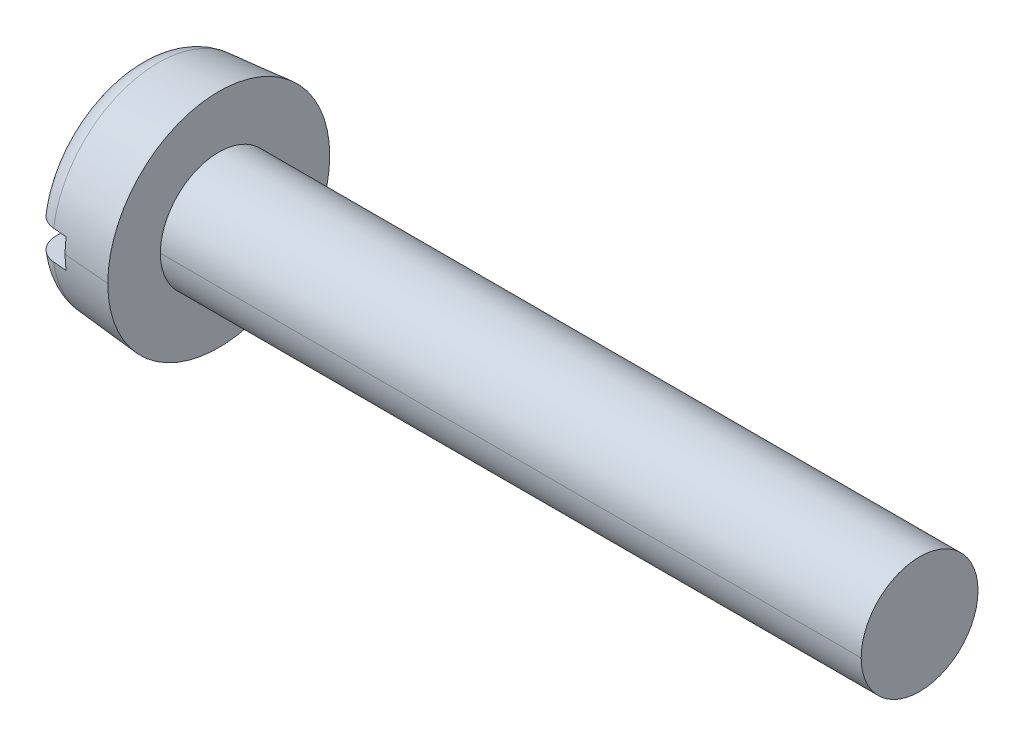
ISO-10303-21;
HEADER;
FILE_DESCRIPTION(('STEP AP214'),'2;1');
FILE_NAME('part.step','',(''),(''),'','','');
FILE_SCHEMA(('AUTOMOTIVE_DESIGN { 1 0 10303 214 1 1 1 1 }'));
ENDSEC;
DATA;
#1=APPLICATION_CONTEXT('core data for automotive mechanical design processes');
#2=APPLICATION_PROTOCOL_DEFINITION('international standard','automotive_design',2000,#1);
#3=PRODUCT_CONTEXT('',#1,'mechanical');
#4=PRODUCT('Part','Part','',(#3));
#5=PRODUCT_RELATED_PRODUCT_CATEGORY('part','',(#4));
#6=PRODUCT_DEFINITION_FORMATION('','',#4);
#7=PRODUCT_DEFINITION_CONTEXT('part definition',#1,'design');
#8=PRODUCT_DEFINITION('design','',#6,#7);
#9=PRODUCT_DEFINITION_SHAPE('','',#8);
#10=(LENGTH_UNIT() NAMED_UNIT(*) SI_UNIT(.MILLI.,.METRE.));
#11=(NAMED_UNIT(*) PLANE_ANGLE_UNIT() SI_UNIT($,.RADIAN.));
#12=(NAMED_UNIT(*) SI_UNIT($,.STERADIAN.) SOLID_ANGLE_UNIT());
#13=UNCERTAINTY_MEASURE_WITH_UNIT(LENGTH_MEASURE(1.E-05),#10,'distance_accuracy_value','');
#14=(GEOMETRIC_REPRESENTATION_CONTEXT(3) GLOBAL_UNCERTAINTY_ASSIGNED_CONTEXT((#13)) GLOBAL_UNIT_ASSIGNED_CONTEXT((#10,
#11,#12)) REPRESENTATION_CONTEXT('',''));
#15=CARTESIAN_POINT('',(0.,0.,0.));
#16=DIRECTION('',(0.,0.,1.));
#17=DIRECTION('',(1.,0.,0.));
#18=AXIS2_PLACEMENT_3D('',#15,#16,#17);
#19=CARTESIAN_POINT('',(0.,0.,0.));
#20=DIRECTION('',(-1.,0.,0.));
#21=DIRECTION('',(0.,0.,1.));
#22=AXIS2_PLACEMENT_3D('',#19,#20,#21);
#23=CYLINDRICAL_SURFACE('',#22,1.);
#24=CARTESIAN_POINT('',(13.4,0.,0.));
#25=DIRECTION('',(-1.,0.,0.));
#26=DIRECTION('',(0.,0.,1.));
#27=AXIS2_PLACEMENT_3D('',#24,#25,#26);
#28=CIRCLE('',#27,1.);
#29=CARTESIAN_POINT('',(13.4,0.,1.));
#30=VERTEX_POINT('',#29);
#31=CARTESIAN_POINT('',(13.4,0.,-1.));
#32=VERTEX_POINT('',#31);
#33=EDGE_CURVE('E11',#30,#32,#28,.T.);
#34=ORIENTED_EDGE('',*,*,#33,.T.);
#35=DIRECTION('',(-1.,0.,0.));
#36=VECTOR('',#35,1.);
#37=CARTESIAN_POINT('',(0.,0.,-1.));
#38=LINE('',#37,#36);
#39=CARTESIAN_POINT('',(1.4,0.,-1.));
#40=VERTEX_POINT('',#39);
#41=EDGE_CURVE('E30',#32,#40,#38,.T.);
#42=ORIENTED_EDGE('',*,*,#41,.T.);
#43=CARTESIAN_POINT('',(1.4,0.,0.));
#44=DIRECTION('',(-1.,0.,0.));
#45=DIRECTION('',(0.,0.,1.));
#46=AXIS2_PLACEMENT_3D('',#43,#44,#45);
#47=CIRCLE('',#46,1.);
#48=CARTESIAN_POINT('',(1.4,0.,1.));
#49=VERTEX_POINT('',#48);
#50=EDGE_CURVE('E326',#49,#40,#47,.T.);
#51=ORIENTED_EDGE('',*,*,#50,.F.);
#52=DIRECTION('',(-1.,0.,0.));
#53=VECTOR('',#52,1.);
#54=CARTESIAN_POINT('',(0.,0.,1.));
#55=LINE('',#54,#53);
#56=EDGE_CURVE('E589',#30,#49,#55,.T.);
#57=ORIENTED_EDGE('',*,*,#56,.F.);
#58=EDGE_LOOP('',(#34,#42,#51,#57));
#59=FACE_BOUND('',#58,.T.);
#60=ADVANCED_FACE('F17',(#59),#23,.T.);
#61=CARTESIAN_POINT('',(1.4,0.,0.));
#62=DIRECTION('',(1.,0.,0.));
#63=DIRECTION('',(0.,0.,-1.));
#64=AXIS2_PLACEMENT_3D('',#61,#62,#63);
#65=CONICAL_SURFACE('',#64,1.9,0.0872664625997163);
#66=CARTESIAN_POINT('',(0.6,0.,0.));
#67=DIRECTION('',(-1.,0.,0.));
#68=DIRECTION('',(0.,0.,1.));
#69=AXIS2_PLACEMENT_3D('',#66,#67,#68);
#70=CIRCLE('',#69,1.83000906917926);
#71=CARTESIAN_POINT('',(0.6,0.,1.83000906917926));
#72=VERTEX_POINT('',#71);
#73=CARTESIAN_POINT('',(0.6,0.25,1.8128522259904));
#74=VERTEX_POINT('',#73);
#75=EDGE_CURVE('E314',#72,#74,#70,.T.);
#76=ORIENTED_EDGE('',*,*,#75,.F.);
#77=DIRECTION('',(0.996194698091746,0.,0.0871557427476584));
#78=VECTOR('',#77,1.);
#79=CARTESIAN_POINT('',(1.4,0.,1.9));
#80=LINE('',#79,#78);
#81=CARTESIAN_POINT('',(1.4,0.,1.9));
#82=VERTEX_POINT('',#81);
#83=EDGE_CURVE('E575',#72,#82,#80,.T.);
#84=ORIENTED_EDGE('',*,*,#83,.T.);
#85=CARTESIAN_POINT('',(1.4,0.,0.));
#86=DIRECTION('',(-1.,0.,0.));
#87=DIRECTION('',(0.,0.,1.));
#88=AXIS2_PLACEMENT_3D('',#85,#86,#87);
#89=CIRCLE('',#88,1.9);
#90=CARTESIAN_POINT('',(1.4,0.,-1.9));
#91=VERTEX_POINT('',#90);
#92=EDGE_CURVE('E187',#82,#91,#89,.T.);
#93=ORIENTED_EDGE('',*,*,#92,.T.);
#94=DIRECTION('',(0.996194698091746,0.,-0.0871557427476584));
#95=VECTOR('',#94,1.);
#96=CARTESIAN_POINT('',(1.4,0.,-1.9));
#97=LINE('',#96,#95);
#98=CARTESIAN_POINT('',(0.6,0.,-1.83000906917926));
#99=VERTEX_POINT('',#98);
#100=EDGE_CURVE('E265',#99,#91,#97,.T.);
#101=ORIENTED_EDGE('',*,*,#100,.F.);
#102=CARTESIAN_POINT('',(0.6,0.,0.));
#103=DIRECTION('',(-1.,0.,0.));
#104=DIRECTION('',(0.,0.,1.));
#105=AXIS2_PLACEMENT_3D('',#102,#103,#104);
#106=CIRCLE('',#105,1.83000906917926);
#107=CARTESIAN_POINT('',(0.6,0.25,-1.8128522259904));
#108=VERTEX_POINT('',#107);
#109=EDGE_CURVE('E583',#108,#99,#106,.T.);
#110=ORIENTED_EDGE('',*,*,#109,.F.);
#111=CARTESIAN_POINT('',(0.6,0.25,-1.8128522259904));
#112=CARTESIAN_POINT('',(0.549769017917673,0.25,-1.80841599358979));
#113=CARTESIAN_POINT('',(0.499538062464663,0.25,-1.8039794596575));
#114=CARTESIAN_POINT('',(0.449307134241759,0.25,-1.7995426174547));
#115=CARTESIAN_POINT('',(0.421250648597372,0.25,-1.79706441918177));
#116=CARTESIAN_POINT('',(0.393194171448044,0.25,-1.7945861247316));
#117=CARTESIAN_POINT('',(0.365137702900937,0.25,-1.79210773290244));
#118=(BOUNDED_CURVE() B_SPLINE_CURVE(3,(#111,#112,#113,#114,#115,#116,#117),.UNSPECIFIED.,.F.,
.F.) B_SPLINE_CURVE_WITH_KNOTS((4,3,4),(0.00319106621206755,0.00334234570568948,
0.00342684286890468),
.UNSPECIFIED.) CURVE() GEOMETRIC_REPRESENTATION_ITEM() RATIONAL_B_SPLINE_CURVE((1.,1.,1.,1.,1.,
1.,1.)) REPRESENTATION_ITEM(''));
#119=CARTESIAN_POINT('',(0.365137702900937,0.25,-1.79210773290244));
#120=VERTEX_POINT('',#119);
#121=EDGE_CURVE('E137',#108,#120,#118,.T.);
#122=ORIENTED_EDGE('',*,*,#121,.T.);
#123=CARTESIAN_POINT('',(0.365137702900937,0.,0.));
#124=DIRECTION('',(1.,0.,0.));
#125=DIRECTION('',(0.,0.,1.));
#126=AXIS2_PLACEMENT_3D('',#123,#124,#125);
#127=CIRCLE('',#126,1.80946128069343);
#128=CARTESIAN_POINT('',(0.365137702900959,0.25,1.79210773290293));
#129=VERTEX_POINT('',#128);
#130=EDGE_CURVE('E132',#120,#129,#127,.T.);
#131=ORIENTED_EDGE('',*,*,#130,.T.);
#132=CARTESIAN_POINT('',(0.365137702900959,0.25,1.79210773290293));
#133=CARTESIAN_POINT('',(0.393194171448087,0.25,1.79458612473161));
#134=CARTESIAN_POINT('',(0.421250648597394,0.25,1.79706441918177));
#135=CARTESIAN_POINT('',(0.449307134241759,0.25,1.7995426174547));
#136=CARTESIAN_POINT('',(0.499538062464663,0.25,1.8039794596575));
#137=CARTESIAN_POINT('',(0.549769017917673,0.25,1.80841599358979));
#138=CARTESIAN_POINT('',(0.6,0.25,1.8128522259904));
#139=(BOUNDED_CURVE() B_SPLINE_CURVE(3,(#132,#133,#134,#135,#136,#137,#138),.UNSPECIFIED.,.F.,
.F.) B_SPLINE_CURVE_WITH_KNOTS((4,3,4),(0.00325784856487663,0.00334234572775568,
0.00349362522084869),
.UNSPECIFIED.) CURVE() GEOMETRIC_REPRESENTATION_ITEM() RATIONAL_B_SPLINE_CURVE((1.,1.,1.,1.,1.,
1.,1.)) REPRESENTATION_ITEM(''));
#140=EDGE_CURVE('E121',#129,#74,#139,.T.);
#141=ORIENTED_EDGE('',*,*,#140,.T.);
#142=EDGE_LOOP('',(#76,#84,#93,#101,#110,#122,#131,#141));
#143=FACE_BOUND('',#142,.T.);
#144=ADVANCED_FACE('F136',(#143),#65,.T.);
#145=CARTESIAN_POINT('',(0.,0.,0.));
#146=DIRECTION('',(1.,0.,0.));
#147=DIRECTION('',(0.,1.,0.));
#148=AXIS2_PLACEMENT_3D('',#145,#146,#147);
#149=PLANE('',#148);
#150=CARTESIAN_POINT('',(0.,0.,0.));
#151=DIRECTION('',(-1.,0.,0.));
#152=DIRECTION('',(0.,0.,-1.));
#153=AXIS2_PLACEMENT_3D('',#150,#151,#152);
#154=CIRCLE('',#153,1.41098340145674);
#155=CARTESIAN_POINT('',(0.,0.25,1.38865912274626));
#156=VERTEX_POINT('',#155);
#157=CARTESIAN_POINT('',(0.,0.25,-1.38865912274626));
#158=VERTEX_POINT('',#157);
#159=EDGE_CURVE('E133',#156,#158,#154,.T.);
#160=ORIENTED_EDGE('',*,*,#159,.T.);
#161=DIRECTION('',(0.,0.,-1.));
#162=VECTOR('',#161,1.);
#163=CARTESIAN_POINT('',(0.,0.25,-1.9));
#164=LINE('',#163,#162);
#165=EDGE_CURVE('E148',#156,#158,#164,.T.);
#166=ORIENTED_EDGE('',*,*,#165,.F.);
#167=EDGE_LOOP('',(#160,#166));
#168=FACE_BOUND('',#167,.T.);
#169=ADVANCED_FACE('F168',(#168),#149,.F.);
#170=CARTESIAN_POINT('',(0.4,0.,0.));
#171=DIRECTION('',(1.,0.,0.));
#172=DIRECTION('',(0.,0.,-1.));
#173=AXIS2_PLACEMENT_3D('',#170,#171,#172);
#174=TOROIDAL_SURFACE('',#173,1.41098340145674,0.4);
#175=CARTESIAN_POINT('',(0.,0.25,-1.38865912274626));
#176=CARTESIAN_POINT('',(0.,0.25,-1.46251622227619));
#177=CARTESIAN_POINT('',(0.026960417168731,0.25,-1.5343648727742));
#178=CARTESIAN_POINT('',(0.053195686998227,0.25,-1.60428102877814));
#179=CARTESIAN_POINT('',(0.103966295066659,0.25,-1.66128361495215));
#180=CARTESIAN_POINT('',(0.152590985685726,0.25,-1.71587687712979));
#181=CARTESIAN_POINT('',(0.222580261018464,0.25,-1.75127465267984));
#182=CARTESIAN_POINT('',(0.290233625586207,0.25,-1.78549101801282));
#183=CARTESIAN_POINT('',(0.365137702900937,0.25,-1.79210773290244));
#184=B_SPLINE_CURVE_WITH_KNOTS('',2,(#175,#176,#177,#178,#179,#180,#181,#182,#183),
.UNSPECIFIED.,.F.,.F.,(3,2,2,2,3),(0.,0.25,0.5,0.75,1.),.UNSPECIFIED.);
#185=EDGE_CURVE('E626',#158,#120,#184,.T.);
#186=ORIENTED_EDGE('',*,*,#185,.F.);
#187=ORIENTED_EDGE('',*,*,#159,.F.);
#188=CARTESIAN_POINT('',(0.365137702900959,0.25,1.79210773290293));
#189=CARTESIAN_POINT('',(0.29185798650255,0.25,1.78563450730545));
#190=CARTESIAN_POINT('',(0.222397826019831,0.25,1.75117859067216));
#191=CARTESIAN_POINT('',(0.155444181685095,0.25,1.71796603873648));
#192=CARTESIAN_POINT('',(0.104194373722597,0.25,1.66153721924653));
#193=CARTESIAN_POINT('',(0.0554327580786059,0.25,1.60784803451385));
#194=CARTESIAN_POINT('',(0.0272203643972849,0.25,1.53472414118304));
#195=CARTESIAN_POINT('',(0.,0.25,1.46417149523968));
#196=CARTESIAN_POINT('',(0.,0.25,1.38865912274627));
#197=B_SPLINE_CURVE_WITH_KNOTS('',2,(#188,#189,#190,#191,#192,#193,#194,#195,#196),
.UNSPECIFIED.,.F.,.F.,(3,2,2,2,3),(0.,0.25,0.5,0.75,1.),.UNSPECIFIED.);
#198=EDGE_CURVE('E125',#129,#156,#197,.T.);
#199=ORIENTED_EDGE('',*,*,#198,.F.);
#200=ORIENTED_EDGE('',*,*,#130,.F.);
#201=EDGE_LOOP('',(#186,#187,#199,#200));
#202=FACE_BOUND('',#201,.T.);
#203=ADVANCED_FACE('F145',(#202),#174,.T.);
#204=CARTESIAN_POINT('',(0.,0.,0.));
#205=DIRECTION('',(1.,0.,0.));
#206=DIRECTION('',(0.,1.,0.));
#207=AXIS2_PLACEMENT_3D('',#204,#205,#206);
#208=PLANE('',#207);
#209=CARTESIAN_POINT('',(0.,0.,0.));
#210=DIRECTION('',(-1.,0.,0.));
#211=DIRECTION('',(0.,0.,-1.));
#212=AXIS2_PLACEMENT_3D('',#209,#210,#211);
#213=CIRCLE('',#212,1.41098340145674);
#214=CARTESIAN_POINT('',(0.,-0.25,-1.38865912274626));
#215=VERTEX_POINT('',#214);
#216=CARTESIAN_POINT('',(0.,-0.25,1.38865912274626));
#217=VERTEX_POINT('',#216);
#218=EDGE_CURVE('E245',#215,#217,#213,.T.);
#219=ORIENTED_EDGE('',*,*,#218,.T.);
#220=DIRECTION('',(0.,0.,1.));
#221=VECTOR('',#220,1.);
#222=CARTESIAN_POINT('',(0.,-0.25,-1.9));
#223=LINE('',#222,#221);
#224=EDGE_CURVE('E272',#215,#217,#223,.T.);
#225=ORIENTED_EDGE('',*,*,#224,.F.);
#226=EDGE_LOOP('',(#219,#225));
#227=FACE_BOUND('',#226,.T.);
#228=ADVANCED_FACE('F167',(#227),#208,.F.);
#229=CARTESIAN_POINT('',(1.4,0.,0.));
#230=DIRECTION('',(1.,0.,0.));
#231=DIRECTION('',(0.,0.,-1.));
#232=AXIS2_PLACEMENT_3D('',#229,#230,#231);
#233=CONICAL_SURFACE('',#232,1.9,0.0872664625997163);
#234=ORIENTED_EDGE('',*,*,#83,.F.);
#235=CARTESIAN_POINT('',(0.6,0.,0.));
#236=DIRECTION('',(-1.,0.,0.));
#237=DIRECTION('',(0.,0.,1.));
#238=AXIS2_PLACEMENT_3D('',#235,#236,#237);
#239=CIRCLE('',#238,1.83000906917926);
#240=CARTESIAN_POINT('',(0.6,-0.25,1.8128522259904));
#241=VERTEX_POINT('',#240);
#242=EDGE_CURVE('E304',#241,#72,#239,.T.);
#243=ORIENTED_EDGE('',*,*,#242,.F.);
#244=CARTESIAN_POINT('',(0.6,-0.25,1.8128522259904));
#245=CARTESIAN_POINT('',(0.549769017917673,-0.25,1.80841599358979));
#246=CARTESIAN_POINT('',(0.499538062464663,-0.25,1.8039794596575));
#247=CARTESIAN_POINT('',(0.449307134241759,-0.25,1.7995426174547));
#248=CARTESIAN_POINT('',(0.421250648596907,-0.25,1.79706441918173));
#249=CARTESIAN_POINT('',(0.393194171447115,-0.25,1.79458612473151));
#250=CARTESIAN_POINT('',(0.365137702898778,-0.25,1.79210773291097));
#251=(BOUNDED_CURVE() B_SPLINE_CURVE(3,(#244,#245,#246,#247,#248,#249,#250),.UNSPECIFIED.,.F.,
.F.) B_SPLINE_CURVE_WITH_KNOTS((4,3,4),(0.00319106621206755,0.00334234570568948,
0.00342684286890607),
.UNSPECIFIED.) CURVE() GEOMETRIC_REPRESENTATION_ITEM() RATIONAL_B_SPLINE_CURVE((1.,1.,1.,1.,1.,
1.,1.)) REPRESENTATION_ITEM(''));
#252=CARTESIAN_POINT('',(0.365137702898778,-0.25,1.79210773291097));
#253=VERTEX_POINT('',#252);
#254=EDGE_CURVE('E237',#241,#253,#251,.T.);
#255=ORIENTED_EDGE('',*,*,#254,.T.);
#256=CARTESIAN_POINT('',(0.365137702900937,0.,0.));
#257=DIRECTION('',(1.,0.,0.));
#258=DIRECTION('',(0.,0.,1.));
#259=AXIS2_PLACEMENT_3D('',#256,#257,#258);
#260=CIRCLE('',#259,1.80946128069343);
#261=CARTESIAN_POINT('',(0.365137702900937,-0.25,-1.79210773290244));
#262=VERTEX_POINT('',#261);
#263=EDGE_CURVE('E246',#253,#262,#260,.T.);
#264=ORIENTED_EDGE('',*,*,#263,.T.);
#265=CARTESIAN_POINT('',(0.365137702900937,-0.25,-1.79210773290244));
#266=CARTESIAN_POINT('',(0.393194171448044,-0.25,-1.7945861247316));
#267=CARTESIAN_POINT('',(0.421250648597372,-0.25,-1.79706441918177));
#268=CARTESIAN_POINT('',(0.449307134241759,-0.25,-1.7995426174547));
#269=CARTESIAN_POINT('',(0.499538062464663,-0.25,-1.8039794596575));
#270=CARTESIAN_POINT('',(0.549769017917673,-0.25,-1.80841599358979));
#271=CARTESIAN_POINT('',(0.6,-0.25,-1.8128522259904));
#272=(BOUNDED_CURVE() B_SPLINE_CURVE(3,(#265,#266,#267,#268,#269,#270,#271),.UNSPECIFIED.,.F.,
.F.) B_SPLINE_CURVE_WITH_KNOTS((4,3,4),(0.00325784856487656,0.00334234572775568,
0.00349362522084869),
.UNSPECIFIED.) CURVE() GEOMETRIC_REPRESENTATION_ITEM() RATIONAL_B_SPLINE_CURVE((1.,1.,1.,1.,1.,
1.,1.)) REPRESENTATION_ITEM(''));
#273=CARTESIAN_POINT('',(0.6,-0.25,-1.8128522259904));
#274=VERTEX_POINT('',#273);
#275=EDGE_CURVE('E215',#262,#274,#272,.T.);
#276=ORIENTED_EDGE('',*,*,#275,.T.);
#277=CARTESIAN_POINT('',(0.6,0.,0.));
#278=DIRECTION('',(-1.,0.,0.));
#279=DIRECTION('',(0.,0.,1.));
#280=AXIS2_PLACEMENT_3D('',#277,#278,#279);
#281=CIRCLE('',#280,1.83000906917926);
#282=EDGE_CURVE('E303',#99,#274,#281,.T.);
#283=ORIENTED_EDGE('',*,*,#282,.F.);
#284=ORIENTED_EDGE('',*,*,#100,.T.);
#285=CARTESIAN_POINT('',(1.4,0.,0.));
#286=DIRECTION('',(-1.,0.,0.));
#287=DIRECTION('',(0.,0.,1.));
#288=AXIS2_PLACEMENT_3D('',#285,#286,#287);
#289=CIRCLE('',#288,1.9);
#290=EDGE_CURVE('E322',#91,#82,#289,.T.);
#291=ORIENTED_EDGE('',*,*,#290,.T.);
#292=EDGE_LOOP('',(#234,#243,#255,#264,#276,#283,#284,#291));
#293=FACE_BOUND('',#292,.T.);
#294=ADVANCED_FACE('F19',(#293),#233,.T.);
#295=CARTESIAN_POINT('',(1.4,1.9,0.));
#296=DIRECTION('',(-1.,0.,0.));
#297=DIRECTION('',(0.,0.,1.));
#298=AXIS2_PLACEMENT_3D('',#295,#296,#297);
#299=PLANE('',#298);
#300=ORIENTED_EDGE('',*,*,#290,.F.);
#301=ORIENTED_EDGE('',*,*,#92,.F.);
#302=EDGE_LOOP('',(#300,#301));
#303=FACE_BOUND('',#302,.T.);
#304=ORIENTED_EDGE('',*,*,#50,.T.);
#305=CARTESIAN_POINT('',(1.4,0.,0.));
#306=DIRECTION('',(-1.,0.,0.));
#307=DIRECTION('',(0.,0.,1.));
#308=AXIS2_PLACEMENT_3D('',#305,#306,#307);
#309=CIRCLE('',#308,1.);
#310=EDGE_CURVE('E667',#40,#49,#309,.T.);
#311=ORIENTED_EDGE('',*,*,#310,.T.);
#312=EDGE_LOOP('',(#304,#311));
#313=FACE_BOUND('',#312,.T.);
#314=ADVANCED_FACE('F228',(#303,#313),#299,.F.);
#315=CARTESIAN_POINT('',(0.,0.,0.));
#316=DIRECTION('',(-1.,0.,0.));
#317=DIRECTION('',(0.,0.,1.));
#318=AXIS2_PLACEMENT_3D('',#315,#316,#317);
#319=CYLINDRICAL_SURFACE('',#318,1.);
#320=ORIENTED_EDGE('',*,*,#41,.F.);
#321=CARTESIAN_POINT('',(13.4,0.,0.));
#322=DIRECTION('',(-1.,0.,0.));
#323=DIRECTION('',(0.,0.,1.));
#324=AXIS2_PLACEMENT_3D('',#321,#322,#323);
#325=CIRCLE('',#324,1.);
#326=EDGE_CURVE('E673',#32,#30,#325,.T.);
#327=ORIENTED_EDGE('',*,*,#326,.T.);
#328=ORIENTED_EDGE('',*,*,#56,.T.);
#329=ORIENTED_EDGE('',*,*,#310,.F.);
#330=EDGE_LOOP('',(#320,#327,#328,#329));
#331=FACE_BOUND('',#330,.T.);
#332=ADVANCED_FACE('F171',(#331),#319,.T.);
#333=CARTESIAN_POINT('',(13.4,1.,0.));
#334=DIRECTION('',(-1.,0.,0.));
#335=DIRECTION('',(0.,0.,1.));
#336=AXIS2_PLACEMENT_3D('',#333,#334,#335);
#337=PLANE('',#336);
#338=ORIENTED_EDGE('',*,*,#33,.F.);
#339=ORIENTED_EDGE('',*,*,#326,.F.);
#340=EDGE_LOOP('',(#338,#339));
#341=FACE_BOUND('',#340,.T.);
#342=ADVANCED_FACE('F227',(#341),#337,.F.);
#343=CARTESIAN_POINT('',(0.4,0.,0.));
#344=DIRECTION('',(1.,0.,0.));
#345=DIRECTION('',(0.,0.,-1.));
#346=AXIS2_PLACEMENT_3D('',#343,#344,#345);
#347=TOROIDAL_SURFACE('',#346,1.41098340145674,0.4);
#348=CARTESIAN_POINT('',(0.365137702900937,-0.25,-1.79210773290244));
#349=CARTESIAN_POINT('',(0.291437131902306,-0.25,-1.78559733075897));
#350=CARTESIAN_POINT('',(0.22219649316851,-0.25,-1.7512156416243));
#351=CARTESIAN_POINT('',(0.155571204508869,-0.25,-1.71813261401084));
#352=CARTESIAN_POINT('',(0.104145980214715,-0.25,-1.66148344588308));
#353=CARTESIAN_POINT('',(0.0551789764167699,-0.25,-1.60754221239432));
#354=CARTESIAN_POINT('',(0.0271281505162559,-0.25,-1.53493574681391));
#355=CARTESIAN_POINT('',(0.,-0.25,-1.46471752458742));
#356=CARTESIAN_POINT('',(0.,-0.25,-1.38865912274626));
#357=B_SPLINE_CURVE_WITH_KNOTS('',2,(#348,#349,#350,#351,#352,#353,#354,#355,#356),
.UNSPECIFIED.,.F.,.F.,(3,2,2,2,3),(0.,0.25,0.5,0.75,1.),.UNSPECIFIED.);
#358=EDGE_CURVE('E199',#262,#215,#357,.T.);
#359=ORIENTED_EDGE('',*,*,#358,.F.);
#360=ORIENTED_EDGE('',*,*,#263,.F.);
#361=CARTESIAN_POINT('',(0.,-0.25,1.38865912274627));
#362=CARTESIAN_POINT('',(0.,-0.25,1.46315447616691));
#363=CARTESIAN_POINT('',(0.0270786285490139,-0.25,1.53498265899196));
#364=CARTESIAN_POINT('',(0.053283148473742,-0.25,1.60449220023733));
#365=CARTESIAN_POINT('',(0.104220023837533,-0.25,1.66156571297043));
#366=CARTESIAN_POINT('',(0.152903956736866,-0.25,1.71611485923006));
#367=CARTESIAN_POINT('',(0.222641905352023,-0.25,1.75136599302031));
#368=CARTESIAN_POINT('',(0.290134778658801,-0.25,1.78548228628779));
#369=CARTESIAN_POINT('',(0.365137702898777,-0.25,1.79210773291097));
#370=B_SPLINE_CURVE_WITH_KNOTS('',2,(#361,#362,#363,#364,#365,#366,#367,#368,#369),
.UNSPECIFIED.,.F.,.F.,(3,2,2,2,3),(0.,0.25,0.5,0.75,1.),.UNSPECIFIED.);
#371=EDGE_CURVE('E275',#217,#253,#370,.T.);
#372=ORIENTED_EDGE('',*,*,#371,.F.);
#373=ORIENTED_EDGE('',*,*,#218,.F.);
#374=EDGE_LOOP('',(#359,#360,#372,#373));
#375=FACE_BOUND('',#374,.T.);
#376=ADVANCED_FACE('F217',(#375),#347,.T.);
#377=CARTESIAN_POINT('',(0.6,-0.25,-1.9));
#378=DIRECTION('',(-1.,0.,0.));
#379=DIRECTION('',(0.,0.,1.));
#380=AXIS2_PLACEMENT_3D('',#377,#378,#379);
#381=PLANE('',#380);
#382=ORIENTED_EDGE('',*,*,#109,.T.);
#383=ORIENTED_EDGE('',*,*,#282,.T.);
#384=DIRECTION('',(0.,0.,1.));
#385=VECTOR('',#384,1.);
#386=CARTESIAN_POINT('',(0.6,-0.25,-1.9));
#387=LINE('',#386,#385);
#388=EDGE_CURVE('E301',#274,#241,#387,.T.);
#389=ORIENTED_EDGE('',*,*,#388,.T.);
#390=ORIENTED_EDGE('',*,*,#242,.T.);
#391=ORIENTED_EDGE('',*,*,#75,.T.);
#392=DIRECTION('',(0.,0.,-1.));
#393=VECTOR('',#392,1.);
#394=CARTESIAN_POINT('',(0.6,0.25,-1.9));
#395=LINE('',#394,#393);
#396=EDGE_CURVE('E129',#74,#108,#395,.T.);
#397=ORIENTED_EDGE('',*,*,#396,.T.);
#398=EDGE_LOOP('',(#382,#383,#389,#390,#391,#397));
#399=FACE_BOUND('',#398,.T.);
#400=ADVANCED_FACE('F226',(#399),#381,.T.);
#401=CARTESIAN_POINT('',(0.6,0.25,-1.9));
#402=DIRECTION('',(0.,1.,0.));
#403=DIRECTION('',(1.,0.,0.));
#404=AXIS2_PLACEMENT_3D('',#401,#402,#403);
#405=PLANE('',#404);
#406=ORIENTED_EDGE('',*,*,#396,.F.);
#407=ORIENTED_EDGE('',*,*,#140,.F.);
#408=ORIENTED_EDGE('',*,*,#198,.T.);
#409=ORIENTED_EDGE('',*,*,#165,.T.);
#410=ORIENTED_EDGE('',*,*,#185,.T.);
#411=ORIENTED_EDGE('',*,*,#121,.F.);
#412=EDGE_LOOP('',(#406,#407,#408,#409,#410,#411));
#413=FACE_BOUND('',#412,.T.);
#414=ADVANCED_FACE('F123',(#413),#405,.F.);
#415=CARTESIAN_POINT('',(0.6,-0.25,-1.9));
#416=DIRECTION('',(0.,-1.,0.));
#417=DIRECTION('',(0.,0.,-1.));
#418=AXIS2_PLACEMENT_3D('',#415,#416,#417);
#419=PLANE('',#418);
#420=ORIENTED_EDGE('',*,*,#358,.T.);
#421=ORIENTED_EDGE('',*,*,#224,.T.);
#422=ORIENTED_EDGE('',*,*,#371,.T.);
#423=ORIENTED_EDGE('',*,*,#254,.F.);
#424=ORIENTED_EDGE('',*,*,#388,.F.);
#425=ORIENTED_EDGE('',*,*,#275,.F.);
#426=EDGE_LOOP('',(#420,#421,#422,#423,#424,#425));
#427=FACE_BOUND('',#426,.T.);
#428=ADVANCED_FACE('F169',(#427),#419,.F.);
#429=CLOSED_SHELL('',(#60,#144,#169,#203,#228,#294,#314,#332,#342,#376,#400,#414,#428));
#430=MANIFOLD_SOLID_BREP('B1',#429);
#431=ADVANCED_BREP_SHAPE_REPRESENTATION('',(#18,#430),#14);
#432=SHAPE_DEFINITION_REPRESENTATION(#9,#431);
ENDSEC;
END-ISO-10303-21;
